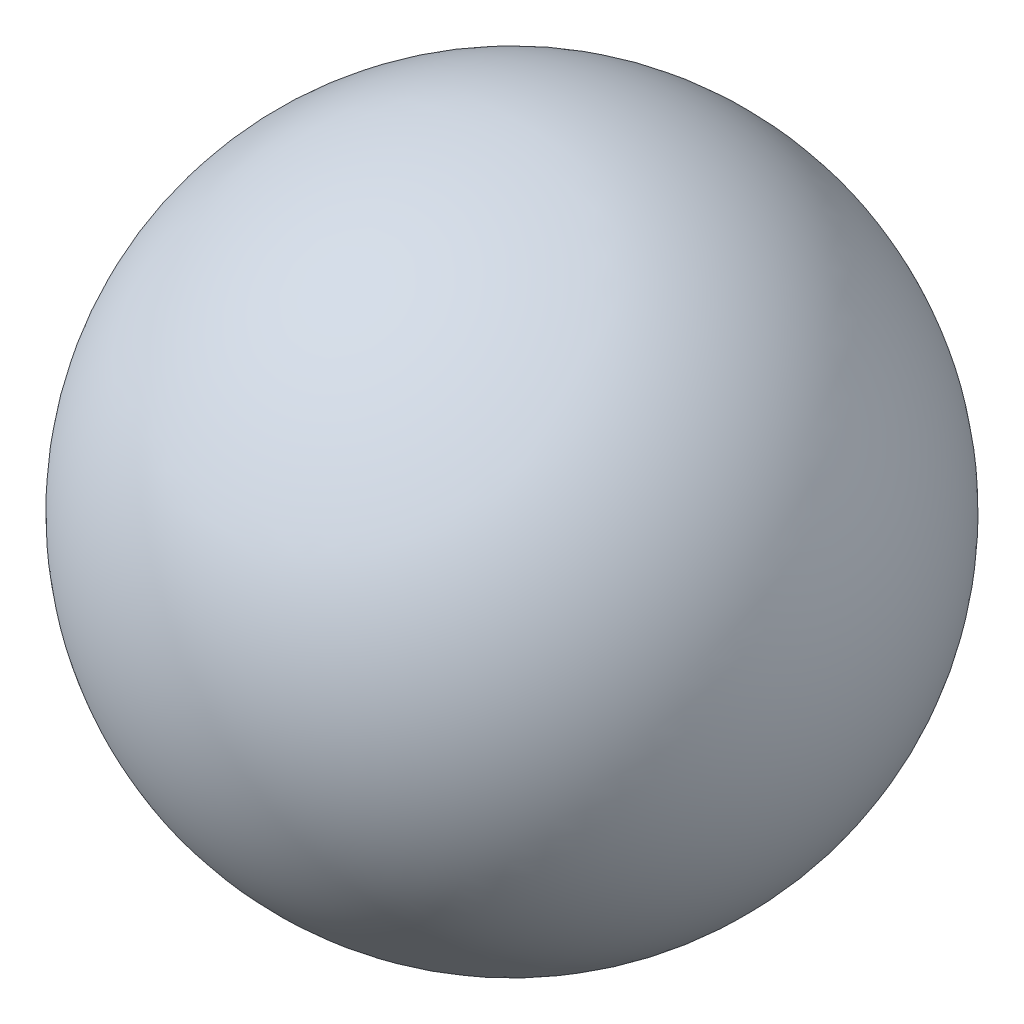
ISO-10303-21;
HEADER;
FILE_DESCRIPTION(('STEP AP214'),'2;1');
FILE_NAME('part.step','',(''),(''),'','','');
FILE_SCHEMA(('AUTOMOTIVE_DESIGN { 1 0 10303 214 1 1 1 1 }'));
ENDSEC;
DATA;
#1=APPLICATION_CONTEXT('core data for automotive mechanical design processes');
#2=APPLICATION_PROTOCOL_DEFINITION('international standard','automotive_design',2000,#1);
#3=PRODUCT_CONTEXT('',#1,'mechanical');
#4=PRODUCT('Part','Part','',(#3));
#5=PRODUCT_RELATED_PRODUCT_CATEGORY('part','',(#4));
#6=PRODUCT_DEFINITION_FORMATION('','',#4);
#7=PRODUCT_DEFINITION_CONTEXT('part definition',#1,'design');
#8=PRODUCT_DEFINITION('design','',#6,#7);
#9=PRODUCT_DEFINITION_SHAPE('','',#8);
#10=(LENGTH_UNIT() NAMED_UNIT(*) SI_UNIT(.MILLI.,.METRE.));
#11=(NAMED_UNIT(*) PLANE_ANGLE_UNIT() SI_UNIT($,.RADIAN.));
#12=(NAMED_UNIT(*) SI_UNIT($,.STERADIAN.) SOLID_ANGLE_UNIT());
#13=UNCERTAINTY_MEASURE_WITH_UNIT(LENGTH_MEASURE(1.E-05),#10,'distance_accuracy_value','');
#14=(GEOMETRIC_REPRESENTATION_CONTEXT(3) GLOBAL_UNCERTAINTY_ASSIGNED_CONTEXT((#13)) GLOBAL_UNIT_ASSIGNED_CONTEXT((#10,
#11,#12)) REPRESENTATION_CONTEXT('',''));
#15=CARTESIAN_POINT('',(0.,0.,0.));
#16=DIRECTION('',(0.,0.,1.));
#17=DIRECTION('',(1.,0.,0.));
#18=AXIS2_PLACEMENT_3D('',#15,#16,#17);
#19=CARTESIAN_POINT('',(0.,0.,0.));
#20=DIRECTION('',(0.,0.,-1.));
#21=DIRECTION('',(1.,0.,0.));
#22=AXIS2_PLACEMENT_3D('',#19,#20,#21);
#23=SPHERICAL_SURFACE('',#22,100.);
#24=CARTESIAN_POINT('',(0.,0.,-100.));
#25=VERTEX_POINT('',#24);
#26=VERTEX_LOOP('',#25);
#27=FACE_BOUND('',#26,.T.);
#28=ADVANCED_FACE('F36',(#27),#23,.T.);
#29=CLOSED_SHELL('',(#28));
#30=CARTESIAN_POINT('',(0.,0.,0.));
#31=DIRECTION('',(0.,0.,-1.));
#32=DIRECTION('',(1.,0.,0.));
#33=AXIS2_PLACEMENT_3D('',#30,#31,#32);
#34=SPHERICAL_SURFACE('',#33,94.2);
#35=CARTESIAN_POINT('',(0.,0.,-94.2));
#36=VERTEX_POINT('',#35);
#37=VERTEX_LOOP('',#36);
#38=FACE_BOUND('',#37,.T.);
#39=ADVANCED_FACE('F49',(#38),#34,.F.);
#40=CLOSED_SHELL('',(#39));
#41=ORIENTED_CLOSED_SHELL('',*,#40,.T.);
#42=BREP_WITH_VOIDS('B2',#29,(#41));
#43=ADVANCED_BREP_SHAPE_REPRESENTATION('',(#18,#42),#14);
#44=SHAPE_DEFINITION_REPRESENTATION(#9,#43);
ENDSEC;
END-ISO-10303-21;
